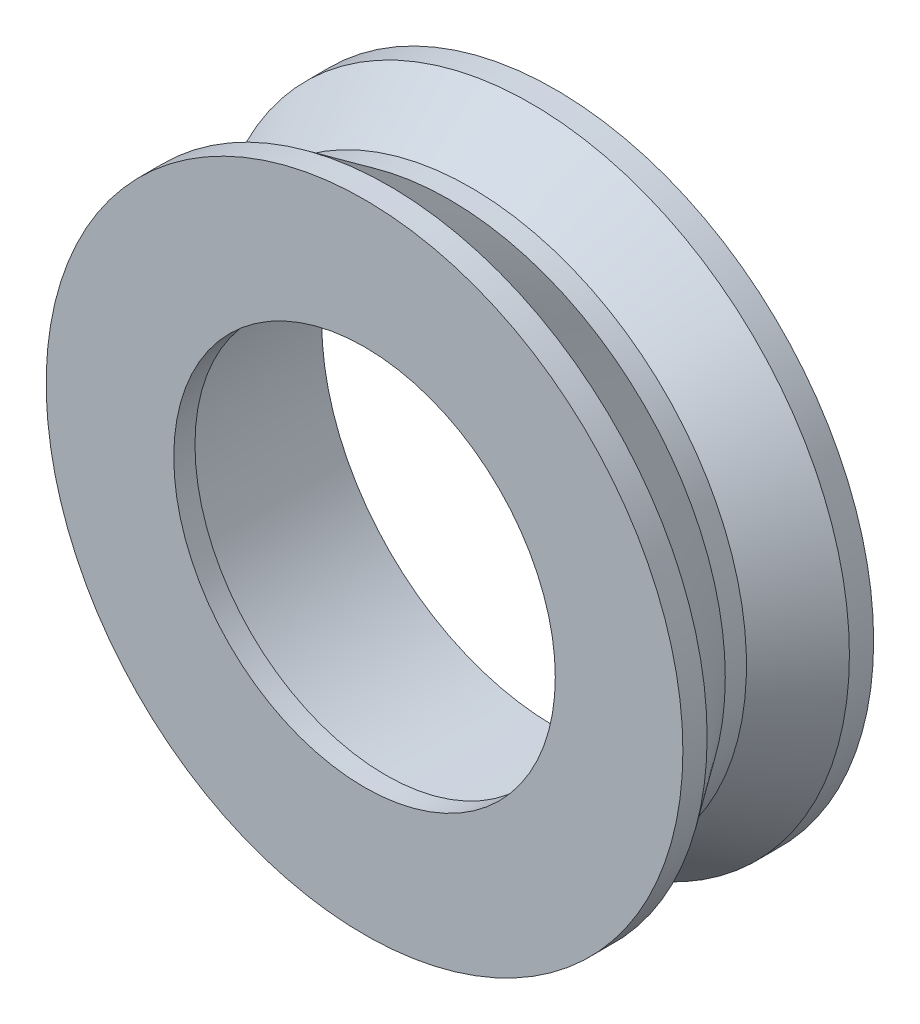
ISO-10303-21;
HEADER;
FILE_DESCRIPTION(('STEP AP214'),'2;1');
FILE_NAME('part.step','',(''),(''),'','','');
FILE_SCHEMA(('AUTOMOTIVE_DESIGN { 1 0 10303 214 1 1 1 1 }'));
ENDSEC;
DATA;
#1=APPLICATION_CONTEXT('core data for automotive mechanical design processes');
#2=APPLICATION_PROTOCOL_DEFINITION('international standard','automotive_design',2000,#1);
#3=PRODUCT_CONTEXT('',#1,'mechanical');
#4=PRODUCT('Part','Part','',(#3));
#5=PRODUCT_RELATED_PRODUCT_CATEGORY('part','',(#4));
#6=PRODUCT_DEFINITION_FORMATION('','',#4);
#7=PRODUCT_DEFINITION_CONTEXT('part definition',#1,'design');
#8=PRODUCT_DEFINITION('design','',#6,#7);
#9=PRODUCT_DEFINITION_SHAPE('','',#8);
#10=(LENGTH_UNIT() NAMED_UNIT(*) SI_UNIT(.MILLI.,.METRE.));
#11=(NAMED_UNIT(*) PLANE_ANGLE_UNIT() SI_UNIT($,.RADIAN.));
#12=(NAMED_UNIT(*) SI_UNIT($,.STERADIAN.) SOLID_ANGLE_UNIT());
#13=UNCERTAINTY_MEASURE_WITH_UNIT(LENGTH_MEASURE(1.E-05),#10,'distance_accuracy_value','');
#14=(GEOMETRIC_REPRESENTATION_CONTEXT(3) GLOBAL_UNCERTAINTY_ASSIGNED_CONTEXT((#13)) GLOBAL_UNIT_ASSIGNED_CONTEXT((#10,
#11,#12)) REPRESENTATION_CONTEXT('',''));
#15=CARTESIAN_POINT('',(0.,0.,0.));
#16=DIRECTION('',(0.,0.,1.));
#17=DIRECTION('',(1.,0.,0.));
#18=AXIS2_PLACEMENT_3D('',#15,#16,#17);
#19=CARTESIAN_POINT('',(0.,0.,7.));
#20=DIRECTION('',(0.,0.,-1.));
#21=DIRECTION('',(-1.,0.,0.));
#22=AXIS2_PLACEMENT_3D('',#19,#20,#21);
#23=CYLINDRICAL_SURFACE('',#22,13.02);
#24=CARTESIAN_POINT('',(0.,0.,3.00000000000001));
#25=DIRECTION('',(0.,0.,1.));
#26=DIRECTION('',(1.,0.,0.));
#27=AXIS2_PLACEMENT_3D('',#24,#25,#26);
#28=CIRCLE('',#27,13.02);
#29=CARTESIAN_POINT('',(-13.02,0.,3.00000000000001));
#30=VERTEX_POINT('',#29);
#31=EDGE_CURVE('E53',#30,#30,#28,.T.);
#32=CARTESIAN_POINT('',(0.,0.,3.99999999999999));
#33=DIRECTION('',(0.,0.,1.));
#34=DIRECTION('',(1.,0.,0.));
#35=AXIS2_PLACEMENT_3D('',#32,#33,#34);
#36=CIRCLE('',#35,13.02);
#37=CARTESIAN_POINT('',(-13.02,0.,3.99999999999999));
#38=VERTEX_POINT('',#37);
#39=EDGE_CURVE('E63',#38,#38,#36,.F.);
#40=CARTESIAN_POINT('',(-13.02,0.,3.00000000000001));
#41=CARTESIAN_POINT('',(-13.02,0.,3.01041666666668));
#42=CARTESIAN_POINT('',(-13.02,0.,3.02083333333335));
#43=CARTESIAN_POINT('',(-13.02,0.,3.04166666666668));
#44=CARTESIAN_POINT('',(-13.02,0.,3.05208333333335));
#45=CARTESIAN_POINT('',(-13.02,0.,3.07291666666668));
#46=CARTESIAN_POINT('',(-13.02,0.,3.08333333333335));
#47=CARTESIAN_POINT('',(-13.02,0.,3.10416666666668));
#48=CARTESIAN_POINT('',(-13.02,0.,3.11458333333334));
#49=CARTESIAN_POINT('',(-13.02,0.,3.13541666666668));
#50=CARTESIAN_POINT('',(-13.02,0.,3.14583333333334));
#51=CARTESIAN_POINT('',(-13.02,0.,3.16666666666668));
#52=CARTESIAN_POINT('',(-13.02,0.,3.17708333333334));
#53=CARTESIAN_POINT('',(-13.02,0.,3.19791666666667));
#54=CARTESIAN_POINT('',(-13.02,0.,3.20833333333334));
#55=CARTESIAN_POINT('',(-13.02,0.,3.22916666666667));
#56=CARTESIAN_POINT('',(-13.02,0.,3.23958333333334));
#57=CARTESIAN_POINT('',(-13.02,0.,3.26041666666667));
#58=CARTESIAN_POINT('',(-13.02,0.,3.27083333333334));
#59=CARTESIAN_POINT('',(-13.02,0.,3.29166666666667));
#60=CARTESIAN_POINT('',(-13.02,0.,3.30208333333334));
#61=CARTESIAN_POINT('',(-13.02,0.,3.32291666666667));
#62=CARTESIAN_POINT('',(-13.02,0.,3.33333333333334));
#63=CARTESIAN_POINT('',(-13.02,0.,3.35416666666667));
#64=CARTESIAN_POINT('',(-13.02,0.,3.36458333333334));
#65=CARTESIAN_POINT('',(-13.02,0.,3.38541666666667));
#66=CARTESIAN_POINT('',(-13.02,0.,3.39583333333334));
#67=CARTESIAN_POINT('',(-13.02,0.,3.41666666666667));
#68=CARTESIAN_POINT('',(-13.02,0.,3.42708333333333));
#69=CARTESIAN_POINT('',(-13.02,0.,3.44791666666667));
#70=CARTESIAN_POINT('',(-13.02,0.,3.45833333333333));
#71=CARTESIAN_POINT('',(-13.02,0.,3.47916666666667));
#72=CARTESIAN_POINT('',(-13.02,0.,3.48958333333333));
#73=CARTESIAN_POINT('',(-13.02,0.,3.51041666666667));
#74=CARTESIAN_POINT('',(-13.02,0.,3.52083333333333));
#75=CARTESIAN_POINT('',(-13.02,0.,3.54166666666667));
#76=CARTESIAN_POINT('',(-13.02,0.,3.55208333333333));
#77=CARTESIAN_POINT('',(-13.02,0.,3.57291666666666));
#78=CARTESIAN_POINT('',(-13.02,0.,3.58333333333333));
#79=CARTESIAN_POINT('',(-13.02,0.,3.60416666666666));
#80=CARTESIAN_POINT('',(-13.02,0.,3.61458333333333));
#81=CARTESIAN_POINT('',(-13.02,0.,3.63541666666666));
#82=CARTESIAN_POINT('',(-13.02,0.,3.64583333333333));
#83=CARTESIAN_POINT('',(-13.02,0.,3.66666666666666));
#84=CARTESIAN_POINT('',(-13.02,0.,3.67708333333333));
#85=CARTESIAN_POINT('',(-13.02,0.,3.69791666666666));
#86=CARTESIAN_POINT('',(-13.02,0.,3.70833333333333));
#87=CARTESIAN_POINT('',(-13.02,0.,3.72916666666666));
#88=CARTESIAN_POINT('',(-13.02,0.,3.73958333333333));
#89=CARTESIAN_POINT('',(-13.02,0.,3.76041666666666));
#90=CARTESIAN_POINT('',(-13.02,0.,3.77083333333333));
#91=CARTESIAN_POINT('',(-13.02,0.,3.79166666666666));
#92=CARTESIAN_POINT('',(-13.02,0.,3.80208333333332));
#93=CARTESIAN_POINT('',(-13.02,0.,3.82291666666666));
#94=CARTESIAN_POINT('',(-13.02,0.,3.83333333333332));
#95=CARTESIAN_POINT('',(-13.02,0.,3.85416666666666));
#96=CARTESIAN_POINT('',(-13.02,0.,3.86458333333332));
#97=CARTESIAN_POINT('',(-13.02,0.,3.88541666666665));
#98=CARTESIAN_POINT('',(-13.02,0.,3.89583333333332));
#99=CARTESIAN_POINT('',(-13.02,0.,3.91666666666665));
#100=CARTESIAN_POINT('',(-13.02,0.,3.92708333333332));
#101=CARTESIAN_POINT('',(-13.02,0.,3.94791666666665));
#102=CARTESIAN_POINT('',(-13.02,0.,3.95833333333332));
#103=CARTESIAN_POINT('',(-13.02,0.,3.97916666666665));
#104=CARTESIAN_POINT('',(-13.02,0.,3.98958333333332));
#105=CARTESIAN_POINT('',(-13.02,0.,3.99999999999999));
#106=B_SPLINE_CURVE_WITH_KNOTS('',3,(#40,#41,#42,#43,#44,#45,#46,#47,#48,#49,#50,#51,#52,#53,
#54,#55,#56,#57,#58,#59,#60,#61,#62,#63,#64,#65,#66,#67,#68,#69,#70,#71,#72,#73,#74,#75,#76,#77,
#78,#79,#80,#81,#82,#83,#84,#85,#86,#87,#88,#89,#90,#91,#92,#93,#94,#95,#96,#97,#98,#99,#100,
#101,#102,#103,#104,#105),.UNSPECIFIED.,.F.,.F.,(4,2,2,2,2,2,2,2,2,2,2,2,2,2,2,2,2,2,2,2,2,2,2,
2,2,2,2,2,2,2,2,2,4),(0.,0.0312499999999992,0.0624999999999983,0.0937499999999975,
0.124999999999997,0.156249999999995,0.187499999999995,0.218749999999994,0.249999999999993,
0.281249999999992,0.312499999999991,0.34374999999999,0.374999999999989,0.406249999999988,
0.437499999999987,0.468749999999987,0.499999999999986,0.531249999999985,0.562499999999984,
0.593749999999983,0.624999999999982,0.656249999999981,0.68749999999998,0.718749999999979,
0.749999999999979,0.781249999999978,0.812499999999977,0.843749999999976,0.874999999999975,
0.906249999999974,0.937499999999973,0.968749999999972,0.999999999999971),.UNSPECIFIED.);
#107=EDGE_CURVE('BSEAM45',#30,#38,#106,.T.);
#108=ORIENTED_EDGE('',*,*,#31,.T.);
#109=ORIENTED_EDGE('',*,*,#39,.T.);
#110=ORIENTED_EDGE('',*,*,#107,.T.);
#111=ORIENTED_EDGE('',*,*,#107,.F.);
#112=EDGE_LOOP('',(#108,#110,#109,#111));
#113=FACE_BOUND('',#112,.T.);
#114=ADVANCED_FACE('F45',(#113),#23,.T.);
#115=CARTESIAN_POINT('',(0.,0.,7.));
#116=DIRECTION('',(0.,0.,-1.));
#117=DIRECTION('',(-1.,0.,0.));
#118=AXIS2_PLACEMENT_3D('',#115,#116,#117);
#119=CYLINDRICAL_SURFACE('',#118,11.02);
#120=CARTESIAN_POINT('',(0.,0.,7.));
#121=DIRECTION('',(0.,0.,1.));
#122=DIRECTION('',(1.,0.,0.));
#123=AXIS2_PLACEMENT_3D('',#120,#121,#122);
#124=CIRCLE('',#123,11.02);
#125=CARTESIAN_POINT('',(11.02,0.,7.));
#126=VERTEX_POINT('',#125);
#127=EDGE_CURVE('E69',#126,#126,#124,.T.);
#128=ORIENTED_EDGE('',*,*,#127,.T.);
#129=EDGE_LOOP('',(#128));
#130=FACE_BOUND('',#129,.T.);
#131=CARTESIAN_POINT('',(0.,0.,-1.));
#132=DIRECTION('',(0.,0.,1.));
#133=DIRECTION('',(1.,0.,0.));
#134=AXIS2_PLACEMENT_3D('',#131,#132,#133);
#135=CIRCLE('',#134,11.02);
#136=CARTESIAN_POINT('',(11.02,0.,-1.));
#137=VERTEX_POINT('',#136);
#138=EDGE_CURVE('E89',#137,#137,#135,.T.);
#139=ORIENTED_EDGE('',*,*,#138,.F.);
#140=EDGE_LOOP('',(#139));
#141=FACE_BOUND('',#140,.T.);
#142=ADVANCED_FACE('F97',(#130,#141),#119,.F.);
#143=CARTESIAN_POINT('',(0.,0.,7.));
#144=DIRECTION('',(0.,0.,1.));
#145=DIRECTION('',(1.,0.,0.));
#146=AXIS2_PLACEMENT_3D('',#143,#144,#145);
#147=PLANE('',#146);
#148=CARTESIAN_POINT('',(0.,0.,7.));
#149=DIRECTION('',(0.,0.,1.));
#150=DIRECTION('',(1.,0.,0.));
#151=AXIS2_PLACEMENT_3D('',#148,#149,#150);
#152=CIRCLE('',#151,9.);
#153=CARTESIAN_POINT('',(9.,0.,7.));
#154=VERTEX_POINT('',#153);
#155=EDGE_CURVE('E74',#154,#154,#152,.T.);
#156=ORIENTED_EDGE('',*,*,#155,.T.);
#157=EDGE_LOOP('',(#156));
#158=FACE_BOUND('',#157,.T.);
#159=ORIENTED_EDGE('',*,*,#127,.F.);
#160=EDGE_LOOP('',(#159));
#161=FACE_BOUND('',#160,.T.);
#162=ADVANCED_FACE('F99',(#158,#161),#147,.F.);
#163=CARTESIAN_POINT('',(0.,0.,8.));
#164=DIRECTION('',(0.,0.,-1.));
#165=DIRECTION('',(-1.,0.,0.));
#166=AXIS2_PLACEMENT_3D('',#163,#164,#165);
#167=CYLINDRICAL_SURFACE('',#166,15.02);
#168=CARTESIAN_POINT('',(0.,0.,6.85629601348418));
#169=DIRECTION('',(0.,0.,1.));
#170=DIRECTION('',(1.,0.,0.));
#171=AXIS2_PLACEMENT_3D('',#168,#169,#170);
#172=CIRCLE('',#171,15.02);
#173=CARTESIAN_POINT('',(15.02,0.,6.85629601348418));
#174=VERTEX_POINT('',#173);
#175=EDGE_CURVE('E58',#174,#174,#172,.T.);
#176=ORIENTED_EDGE('',*,*,#175,.T.);
#177=EDGE_LOOP('',(#176));
#178=FACE_BOUND('',#177,.T.);
#179=CARTESIAN_POINT('',(0.,0.,8.));
#180=DIRECTION('',(0.,0.,1.));
#181=DIRECTION('',(1.,0.,0.));
#182=AXIS2_PLACEMENT_3D('',#179,#180,#181);
#183=CIRCLE('',#182,15.02);
#184=CARTESIAN_POINT('',(15.02,0.,8.));
#185=VERTEX_POINT('',#184);
#186=EDGE_CURVE('E78',#185,#185,#183,.T.);
#187=ORIENTED_EDGE('',*,*,#186,.F.);
#188=EDGE_LOOP('',(#187));
#189=FACE_BOUND('',#188,.T.);
#190=ADVANCED_FACE('F106',(#178,#189),#167,.T.);
#191=CARTESIAN_POINT('',(0.,0.,8.));
#192=DIRECTION('',(0.,0.,-1.));
#193=DIRECTION('',(-1.,0.,0.));
#194=AXIS2_PLACEMENT_3D('',#191,#192,#193);
#195=CYLINDRICAL_SURFACE('',#194,9.);
#196=CARTESIAN_POINT('',(0.,0.,8.));
#197=DIRECTION('',(0.,0.,1.));
#198=DIRECTION('',(1.,0.,0.));
#199=AXIS2_PLACEMENT_3D('',#196,#197,#198);
#200=CIRCLE('',#199,9.);
#201=CARTESIAN_POINT('',(9.,0.,8.));
#202=VERTEX_POINT('',#201);
#203=EDGE_CURVE('E73',#202,#202,#200,.T.);
#204=ORIENTED_EDGE('',*,*,#203,.T.);
#205=EDGE_LOOP('',(#204));
#206=FACE_BOUND('',#205,.T.);
#207=ORIENTED_EDGE('',*,*,#155,.F.);
#208=EDGE_LOOP('',(#207));
#209=FACE_BOUND('',#208,.T.);
#210=ADVANCED_FACE('F128',(#206,#209),#195,.F.);
#211=CARTESIAN_POINT('',(0.,0.,8.));
#212=DIRECTION('',(0.,0.,1.));
#213=DIRECTION('',(1.,0.,0.));
#214=AXIS2_PLACEMENT_3D('',#211,#212,#213);
#215=PLANE('',#214);
#216=ORIENTED_EDGE('',*,*,#186,.T.);
#217=EDGE_LOOP('',(#216));
#218=FACE_BOUND('',#217,.T.);
#219=ORIENTED_EDGE('',*,*,#203,.F.);
#220=EDGE_LOOP('',(#219));
#221=FACE_BOUND('',#220,.T.);
#222=ADVANCED_FACE('F131',(#218,#221),#215,.T.);
#223=CARTESIAN_POINT('',(0.,0.,-1.));
#224=DIRECTION('',(0.,0.,1.));
#225=DIRECTION('',(1.,0.,0.));
#226=AXIS2_PLACEMENT_3D('',#223,#224,#225);
#227=CYLINDRICAL_SURFACE('',#226,15.02);
#228=CARTESIAN_POINT('',(0.,0.,0.143703986515823));
#229=DIRECTION('',(0.,0.,-1.));
#230=DIRECTION('',(-1.,0.,0.));
#231=AXIS2_PLACEMENT_3D('',#228,#229,#230);
#232=CIRCLE('',#231,15.02);
#233=CARTESIAN_POINT('',(-15.02,0.,0.143703986515824));
#234=VERTEX_POINT('',#233);
#235=EDGE_CURVE('E11',#234,#234,#232,.T.);
#236=ORIENTED_EDGE('',*,*,#235,.T.);
#237=EDGE_LOOP('',(#236));
#238=FACE_BOUND('',#237,.T.);
#239=CARTESIAN_POINT('',(0.,0.,-1.));
#240=DIRECTION('',(0.,0.,1.));
#241=DIRECTION('',(1.,0.,0.));
#242=AXIS2_PLACEMENT_3D('',#239,#240,#241);
#243=CIRCLE('',#242,15.02);
#244=CARTESIAN_POINT('',(15.02,0.,-1.));
#245=VERTEX_POINT('',#244);
#246=EDGE_CURVE('E79',#245,#245,#243,.T.);
#247=ORIENTED_EDGE('',*,*,#246,.T.);
#248=EDGE_LOOP('',(#247));
#249=FACE_BOUND('',#248,.T.);
#250=ADVANCED_FACE('F120',(#238,#249),#227,.T.);
#251=CARTESIAN_POINT('',(0.,0.,-1.));
#252=DIRECTION('',(0.,0.,1.));
#253=DIRECTION('',(1.,0.,0.));
#254=AXIS2_PLACEMENT_3D('',#251,#252,#253);
#255=PLANE('',#254);
#256=ORIENTED_EDGE('',*,*,#138,.T.);
#257=EDGE_LOOP('',(#256));
#258=FACE_BOUND('',#257,.T.);
#259=ORIENTED_EDGE('',*,*,#246,.F.);
#260=EDGE_LOOP('',(#259));
#261=FACE_BOUND('',#260,.T.);
#262=ADVANCED_FACE('F94',(#258,#261),#255,.F.);
#263=CARTESIAN_POINT('',(0.,0.,7.));
#264=DIRECTION('',(0.,0.,1.));
#265=DIRECTION('',(1.,0.,0.));
#266=AXIS2_PLACEMENT_3D('',#263,#264,#265);
#267=CONICAL_SURFACE('',#266,15.1206226146292,0.610865238198022);
#268=ORIENTED_EDGE('',*,*,#39,.F.);
#269=EDGE_LOOP('',(#268));
#270=FACE_BOUND('',#269,.T.);
#271=ORIENTED_EDGE('',*,*,#175,.F.);
#272=EDGE_LOOP('',(#271));
#273=FACE_BOUND('',#272,.T.);
#274=ADVANCED_FACE('F112',(#270,#273),#267,.T.);
#275=CARTESIAN_POINT('',(0.,0.,3.00000000000001));
#276=DIRECTION('',(0.,0.,-1.));
#277=DIRECTION('',(-1.,0.,0.));
#278=AXIS2_PLACEMENT_3D('',#275,#276,#277);
#279=CONICAL_SURFACE('',#278,13.02,0.610865238198022);
#280=CARTESIAN_POINT('',(-15.02,0.,0.143703986515824));
#281=CARTESIAN_POINT('',(-14.9991666666667,0.,0.173457069989617));
#282=CARTESIAN_POINT('',(-14.9783333333333,0.,0.203210153463411));
#283=CARTESIAN_POINT('',(-14.9366666666667,0.,0.262716320410998));
#284=CARTESIAN_POINT('',(-14.9158333333333,0.,0.292469403884792));
#285=CARTESIAN_POINT('',(-14.8741666666667,0.,0.351975570832379));
#286=CARTESIAN_POINT('',(-14.8533333333333,0.,0.381728654306173));
#287=CARTESIAN_POINT('',(-14.8116666666667,0.,0.44123482125376));
#288=CARTESIAN_POINT('',(-14.7908333333333,0.,0.470987904727554));
#289=CARTESIAN_POINT('',(-14.7491666666667,0.,0.530494071675141));
#290=CARTESIAN_POINT('',(-14.7283333333333,0.,0.560247155148935));
#291=CARTESIAN_POINT('',(-14.6866666666667,0.,0.619753322096522));
#292=CARTESIAN_POINT('',(-14.6658333333333,0.,0.649506405570316));
#293=CARTESIAN_POINT('',(-14.6241666666667,0.,0.709012572517903));
#294=CARTESIAN_POINT('',(-14.6033333333333,0.,0.738765655991697));
#295=CARTESIAN_POINT('',(-14.5616666666667,0.,0.798271822939284));
#296=CARTESIAN_POINT('',(-14.5408333333333,0.,0.828024906413078));
#297=CARTESIAN_POINT('',(-14.4991666666667,0.,0.887531073360665));
#298=CARTESIAN_POINT('',(-14.4783333333333,0.,0.917284156834459));
#299=CARTESIAN_POINT('',(-14.4366666666667,0.,0.976790323782046));
#300=CARTESIAN_POINT('',(-14.4158333333333,0.,1.00654340725584));
#301=CARTESIAN_POINT('',(-14.3741666666667,0.,1.06604957420343));
#302=CARTESIAN_POINT('',(-14.3533333333333,0.,1.09580265767722));
#303=CARTESIAN_POINT('',(-14.3116666666667,0.,1.15530882462481));
#304=CARTESIAN_POINT('',(-14.2908333333333,0.,1.1850619080986));
#305=CARTESIAN_POINT('',(-14.2491666666667,0.,1.24456807504619));
#306=CARTESIAN_POINT('',(-14.2283333333333,0.,1.27432115851998));
#307=CARTESIAN_POINT('',(-14.1866666666667,0.,1.33382732546757));
#308=CARTESIAN_POINT('',(-14.1658333333333,0.,1.36358040894136));
#309=CARTESIAN_POINT('',(-14.1241666666667,0.,1.42308657588895));
#310=CARTESIAN_POINT('',(-14.1033333333333,0.,1.45283965936274));
#311=CARTESIAN_POINT('',(-14.0616666666667,0.,1.51234582631033));
#312=CARTESIAN_POINT('',(-14.0408333333333,0.,1.54209890978413));
#313=CARTESIAN_POINT('',(-13.9991666666667,0.,1.60160507673171));
#314=CARTESIAN_POINT('',(-13.9783333333333,0.,1.63135816020551));
#315=CARTESIAN_POINT('',(-13.9366666666667,0.,1.69086432715309));
#316=CARTESIAN_POINT('',(-13.9158333333333,0.,1.72061741062689));
#317=CARTESIAN_POINT('',(-13.8741666666667,0.,1.78012357757447));
#318=CARTESIAN_POINT('',(-13.8533333333333,0.,1.80987666104827));
#319=CARTESIAN_POINT('',(-13.8116666666667,0.,1.86938282799586));
#320=CARTESIAN_POINT('',(-13.7908333333333,0.,1.89913591146965));
#321=CARTESIAN_POINT('',(-13.7491666666667,0.,1.95864207841724));
#322=CARTESIAN_POINT('',(-13.7283333333333,0.,1.98839516189103));
#323=CARTESIAN_POINT('',(-13.6866666666667,0.,2.04790132883862));
#324=CARTESIAN_POINT('',(-13.6658333333333,0.,2.07765441231241));
#325=CARTESIAN_POINT('',(-13.6241666666667,0.,2.13716057926));
#326=CARTESIAN_POINT('',(-13.6033333333333,0.,2.16691366273379));
#327=CARTESIAN_POINT('',(-13.5616666666667,0.,2.22641982968138));
#328=CARTESIAN_POINT('',(-13.5408333333333,0.,2.25617291315517));
#329=CARTESIAN_POINT('',(-13.4991666666667,0.,2.31567908010276));
#330=CARTESIAN_POINT('',(-13.4783333333333,0.,2.34543216357655));
#331=CARTESIAN_POINT('',(-13.4366666666667,0.,2.40493833052414));
#332=CARTESIAN_POINT('',(-13.4158333333333,0.,2.43469141399793));
#333=CARTESIAN_POINT('',(-13.3741666666667,0.,2.49419758094552));
#334=CARTESIAN_POINT('',(-13.3533333333333,0.,2.52395066441932));
#335=CARTESIAN_POINT('',(-13.3116666666667,0.,2.5834568313669));
#336=CARTESIAN_POINT('',(-13.2908333333333,0.,2.6132099148407));
#337=CARTESIAN_POINT('',(-13.2491666666667,0.,2.67271608178828));
#338=CARTESIAN_POINT('',(-13.2283333333333,0.,2.70246916526208));
#339=CARTESIAN_POINT('',(-13.1866666666667,0.,2.76197533220967));
#340=CARTESIAN_POINT('',(-13.1658333333333,0.,2.79172841568346));
#341=CARTESIAN_POINT('',(-13.1241666666667,0.,2.85123458263105));
#342=CARTESIAN_POINT('',(-13.1033333333333,0.,2.88098766610484));
#343=CARTESIAN_POINT('',(-13.0616666666667,0.,2.94049383305243));
#344=CARTESIAN_POINT('',(-13.0408333333333,0.,2.97024691652622));
#345=CARTESIAN_POINT('',(-13.02,0.,3.00000000000001));
#346=B_SPLINE_CURVE_WITH_KNOTS('',3,(#280,#281,#282,#283,#284,#285,#286,#287,#288,#289,#290,
#291,#292,#293,#294,#295,#296,#297,#298,#299,#300,#301,#302,#303,#304,#305,#306,#307,#308,#309,
#310,#311,#312,#313,#314,#315,#316,#317,#318,#319,#320,#321,#322,#323,#324,#325,#326,#327,#328,
#329,#330,#331,#332,#333,#334,#335,#336,#337,#338,#339,#340,#341,#342,#343,#344,#345),
.UNSPECIFIED.,.F.,.F.,(4,2,2,2,2,2,2,2,2,2,2,2,2,2,2,2,2,2,2,2,2,2,2,2,2,2,2,2,2,2,2,2,4),(0.,
0.108965424726318,0.217930849452636,0.326896274178953,0.435861698905271,0.544827123631588,
0.653792548357906,0.762757973084224,0.871723397810541,0.980688822536859,1.08965424726318,
1.19861967198949,1.30758509671581,1.41655052144213,1.52551594616845,1.63448137089476,
1.74344679562108,1.8524122203474,1.96137764507372,2.07034306980004,2.17930849452635,
2.28827391925267,2.39723934397899,2.50620476870531,2.61517019343162,2.72413561815794,
2.83310104288426,2.94206646761058,3.05103189233689,3.15999731706321,3.26896274178953,
3.37792816651585,3.48689359124217),.UNSPECIFIED.);
#347=EDGE_CURVE('BSEAM47',#234,#30,#346,.T.);
#348=ORIENTED_EDGE('',*,*,#235,.F.);
#349=ORIENTED_EDGE('',*,*,#31,.F.);
#350=ORIENTED_EDGE('',*,*,#347,.T.);
#351=ORIENTED_EDGE('',*,*,#347,.F.);
#352=EDGE_LOOP('',(#348,#350,#349,#351));
#353=FACE_BOUND('',#352,.T.);
#354=ADVANCED_FACE('F47',(#353),#279,.T.);
#355=CLOSED_SHELL('',(#114,#142,#162,#190,#210,#222,#250,#262,#274,#354));
#356=MANIFOLD_SOLID_BREP('B2',#355);
#357=ADVANCED_BREP_SHAPE_REPRESENTATION('',(#18,#356),#14);
#358=SHAPE_DEFINITION_REPRESENTATION(#9,#357);
ENDSEC;
END-ISO-10303-21;
